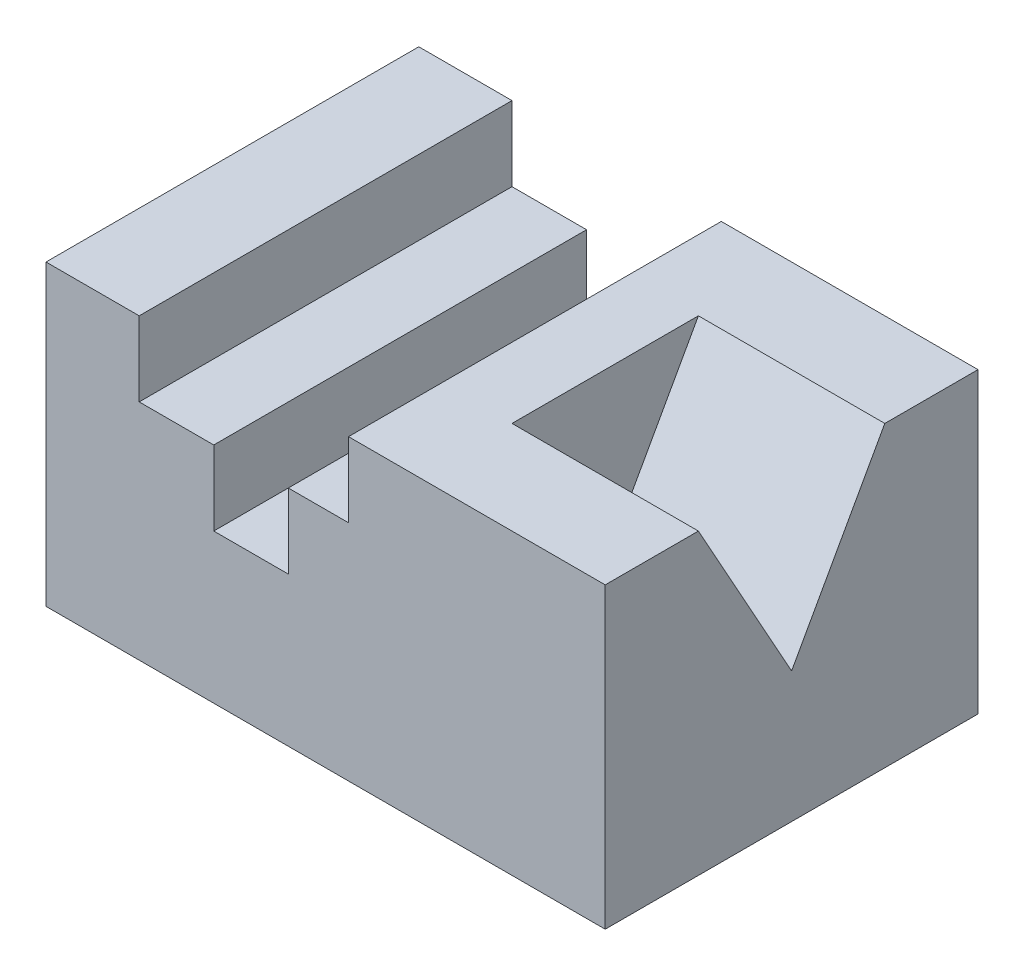
ISO-10303-21;
HEADER;
FILE_DESCRIPTION(('STEP AP214'),'2;1');
FILE_NAME('part.step','',(''),(''),'','','');
FILE_SCHEMA(('AUTOMOTIVE_DESIGN { 1 0 10303 214 1 1 1 1 }'));
ENDSEC;
DATA;
#1=APPLICATION_CONTEXT('core data for automotive mechanical design processes');
#2=APPLICATION_PROTOCOL_DEFINITION('international standard','automotive_design',2000,#1);
#3=PRODUCT_CONTEXT('',#1,'mechanical');
#4=PRODUCT('Part','Part','',(#3));
#5=PRODUCT_RELATED_PRODUCT_CATEGORY('part','',(#4));
#6=PRODUCT_DEFINITION_FORMATION('','',#4);
#7=PRODUCT_DEFINITION_CONTEXT('part definition',#1,'design');
#8=PRODUCT_DEFINITION('design','',#6,#7);
#9=PRODUCT_DEFINITION_SHAPE('','',#8);
#10=(LENGTH_UNIT() NAMED_UNIT(*) SI_UNIT(.MILLI.,.METRE.));
#11=(NAMED_UNIT(*) PLANE_ANGLE_UNIT() SI_UNIT($,.RADIAN.));
#12=(NAMED_UNIT(*) SI_UNIT($,.STERADIAN.) SOLID_ANGLE_UNIT());
#13=UNCERTAINTY_MEASURE_WITH_UNIT(LENGTH_MEASURE(1.E-05),#10,'distance_accuracy_value','');
#14=(GEOMETRIC_REPRESENTATION_CONTEXT(3) GLOBAL_UNCERTAINTY_ASSIGNED_CONTEXT((#13)) GLOBAL_UNIT_ASSIGNED_CONTEXT((#10,
#11,#12)) REPRESENTATION_CONTEXT('',''));
#15=CARTESIAN_POINT('',(0.,0.,0.));
#16=DIRECTION('',(0.,0.,1.));
#17=DIRECTION('',(1.,0.,0.));
#18=AXIS2_PLACEMENT_3D('',#15,#16,#17);
#19=CARTESIAN_POINT('',(-59.8228170907612,44.4267392149242,-100.));
#20=DIRECTION('',(0.,1.,0.));
#21=DIRECTION('',(-1.,0.,0.));
#22=AXIS2_PLACEMENT_3D('',#19,#20,#21);
#23=PLANE('',#22);
#24=DIRECTION('',(-1.,0.,0.));
#25=VECTOR('',#24,1.);
#26=CARTESIAN_POINT('',(-59.8228170907612,44.4267392149242,0.));
#27=LINE('',#26,#25);
#28=CARTESIAN_POINT('',(-34.8228170907612,44.4267392149242,0.));
#29=VERTEX_POINT('',#28);
#30=CARTESIAN_POINT('',(-59.8228170907612,44.4267392149242,0.));
#31=VERTEX_POINT('',#30);
#32=EDGE_CURVE('E252',#29,#31,#27,.T.);
#33=ORIENTED_EDGE('',*,*,#32,.F.);
#34=DIRECTION('',(0.,0.,-1.));
#35=VECTOR('',#34,1.);
#36=CARTESIAN_POINT('',(-34.8228170907612,44.4267392149242,246.53853654145));
#37=LINE('',#36,#35);
#38=CARTESIAN_POINT('',(-34.8228170907612,44.4267392149242,-100.));
#39=VERTEX_POINT('',#38);
#40=EDGE_CURVE('E208',#29,#39,#37,.T.);
#41=ORIENTED_EDGE('',*,*,#40,.T.);
#42=DIRECTION('',(-1.,0.,0.));
#43=VECTOR('',#42,1.);
#44=CARTESIAN_POINT('',(-59.8228170907612,44.4267392149242,-100.));
#45=LINE('',#44,#43);
#46=CARTESIAN_POINT('',(-59.8228170907612,44.4267392149242,-100.));
#47=VERTEX_POINT('',#46);
#48=EDGE_CURVE('E238',#39,#47,#45,.T.);
#49=ORIENTED_EDGE('',*,*,#48,.T.);
#50=DIRECTION('',(0.,0.,1.));
#51=VECTOR('',#50,1.);
#52=CARTESIAN_POINT('',(-59.8228170907612,44.4267392149242,-100.));
#53=LINE('',#52,#51);
#54=EDGE_CURVE('E11',#47,#31,#53,.T.);
#55=ORIENTED_EDGE('',*,*,#54,.T.);
#56=EDGE_LOOP('',(#33,#41,#49,#55));
#57=FACE_BOUND('',#56,.T.);
#58=ADVANCED_FACE('F39',(#57),#23,.T.);
#59=CARTESIAN_POINT('',(-59.8228170907612,44.4267392149242,-100.));
#60=DIRECTION('',(-1.,0.,0.));
#61=DIRECTION('',(0.,0.,1.));
#62=AXIS2_PLACEMENT_3D('',#59,#60,#61);
#63=PLANE('',#62);
#64=DIRECTION('',(0.,-1.,0.));
#65=VECTOR('',#64,1.);
#66=CARTESIAN_POINT('',(-59.8228170907612,44.4267392149242,0.));
#67=LINE('',#66,#65);
#68=CARTESIAN_POINT('',(-59.8228170907612,-35.5732607850758,0.));
#69=VERTEX_POINT('',#68);
#70=EDGE_CURVE('E187',#31,#69,#67,.T.);
#71=ORIENTED_EDGE('',*,*,#70,.F.);
#72=ORIENTED_EDGE('',*,*,#54,.F.);
#73=DIRECTION('',(0.,-1.,0.));
#74=VECTOR('',#73,1.);
#75=CARTESIAN_POINT('',(-59.8228170907612,44.4267392149242,-100.));
#76=LINE('',#75,#74);
#77=CARTESIAN_POINT('',(-59.8228170907612,-35.5732607850758,-100.));
#78=VERTEX_POINT('',#77);
#79=EDGE_CURVE('E228',#47,#78,#76,.T.);
#80=ORIENTED_EDGE('',*,*,#79,.T.);
#81=DIRECTION('',(0.,0.,1.));
#82=VECTOR('',#81,1.);
#83=CARTESIAN_POINT('',(-59.8228170907612,-35.5732607850758,-100.));
#84=LINE('',#83,#82);
#85=EDGE_CURVE('E43',#78,#69,#84,.T.);
#86=ORIENTED_EDGE('',*,*,#85,.T.);
#87=EDGE_LOOP('',(#71,#72,#80,#86));
#88=FACE_BOUND('',#87,.T.);
#89=ADVANCED_FACE('F41',(#88),#63,.T.);
#90=DIRECTION('',(-1.,0.,0.));
#91=VECTOR('',#90,1.);
#92=CARTESIAN_POINT('',(492.965719450689,44.4267392149243,-75.));
#93=LINE('',#92,#91);
#94=CARTESIAN_POINT('',(90.1771829092388,44.4267392149243,-75.));
#95=VERTEX_POINT('',#94);
#96=CARTESIAN_POINT('',(40.1771829092388,44.4267392149243,-75.));
#97=VERTEX_POINT('',#96);
#98=EDGE_CURVE('E57',#95,#97,#93,.T.);
#99=ORIENTED_EDGE('',*,*,#98,.F.);
#100=DIRECTION('',(0.,0.,1.));
#101=VECTOR('',#100,1.);
#102=CARTESIAN_POINT('',(90.1771829092388,44.4267392149243,-100.));
#103=LINE('',#102,#101);
#104=CARTESIAN_POINT('',(90.1771829092388,44.4267392149243,-100.));
#105=VERTEX_POINT('',#104);
#106=EDGE_CURVE('E48',#105,#95,#103,.T.);
#107=ORIENTED_EDGE('',*,*,#106,.F.);
#108=CARTESIAN_POINT('',(21.3197011929034,44.4267392149243,-100.));
#109=VERTEX_POINT('',#108);
#110=EDGE_CURVE('E242',#105,#109,#45,.T.);
#111=ORIENTED_EDGE('',*,*,#110,.T.);
#112=DIRECTION('',(0.,0.,-1.));
#113=VECTOR('',#112,1.);
#114=CARTESIAN_POINT('',(21.3197011929034,44.4267392149243,246.53853654145));
#115=LINE('',#114,#113);
#116=CARTESIAN_POINT('',(21.3197011929034,44.4267392149243,0.));
#117=VERTEX_POINT('',#116);
#118=EDGE_CURVE('E221',#117,#109,#115,.T.);
#119=ORIENTED_EDGE('',*,*,#118,.F.);
#120=CARTESIAN_POINT('',(90.1771829092388,44.4267392149243,0.));
#121=VERTEX_POINT('',#120);
#122=EDGE_CURVE('E232',#121,#117,#27,.T.);
#123=ORIENTED_EDGE('',*,*,#122,.F.);
#124=CARTESIAN_POINT('',(90.1771829092388,44.4267392149243,-25.));
#125=VERTEX_POINT('',#124);
#126=EDGE_CURVE('E258',#125,#121,#103,.T.);
#127=ORIENTED_EDGE('',*,*,#126,.F.);
#128=DIRECTION('',(-1.,0.,0.));
#129=VECTOR('',#128,1.);
#130=CARTESIAN_POINT('',(492.965719450689,44.4267392149243,-25.));
#131=LINE('',#130,#129);
#132=CARTESIAN_POINT('',(40.1771829092388,44.4267392149243,-25.));
#133=VERTEX_POINT('',#132);
#134=EDGE_CURVE('E161',#125,#133,#131,.T.);
#135=ORIENTED_EDGE('',*,*,#134,.T.);
#136=DIRECTION('',(0.,0.,1.));
#137=VECTOR('',#136,1.);
#138=CARTESIAN_POINT('',(40.1771829092388,44.4267392149243,-100.));
#139=LINE('',#138,#137);
#140=EDGE_CURVE('E155',#97,#133,#139,.T.);
#141=ORIENTED_EDGE('',*,*,#140,.F.);
#142=EDGE_LOOP('',(#99,#107,#111,#119,#123,#127,#135,#141));
#143=FACE_BOUND('',#142,.T.);
#144=ADVANCED_FACE('F283',(#143),#23,.T.);
#145=CARTESIAN_POINT('',(90.1771829092388,44.4267392149243,-100.));
#146=DIRECTION('',(1.,0.,0.));
#147=DIRECTION('',(0.,0.,-1.));
#148=AXIS2_PLACEMENT_3D('',#145,#146,#147);
#149=PLANE('',#148);
#150=DIRECTION('',(0.,0.874157276121538,-0.485642931178632));
#151=VECTOR('',#150,1.);
#152=CARTESIAN_POINT('',(90.1771829092388,-0.573260785075747,-50.));
#153=LINE('',#152,#151);
#154=CARTESIAN_POINT('',(90.1771829092388,-0.573260785075747,-50.));
#155=VERTEX_POINT('',#154);
#156=EDGE_CURVE('E167',#155,#95,#153,.T.);
#157=ORIENTED_EDGE('',*,*,#156,.F.);
#158=DIRECTION('',(0.,-0.874157276121538,-0.485642931178632));
#159=VECTOR('',#158,1.);
#160=CARTESIAN_POINT('',(90.1771829092388,44.4267392149243,-25.));
#161=LINE('',#160,#159);
#162=EDGE_CURVE('E164',#125,#155,#161,.T.);
#163=ORIENTED_EDGE('',*,*,#162,.F.);
#164=ORIENTED_EDGE('',*,*,#126,.T.);
#165=DIRECTION('',(0.,1.,0.));
#166=VECTOR('',#165,1.);
#167=CARTESIAN_POINT('',(90.1771829092388,44.4267392149243,0.));
#168=LINE('',#167,#166);
#169=CARTESIAN_POINT('',(90.1771829092388,-35.5732607850758,0.));
#170=VERTEX_POINT('',#169);
#171=EDGE_CURVE('E247',#170,#121,#168,.T.);
#172=ORIENTED_EDGE('',*,*,#171,.F.);
#173=DIRECTION('',(0.,0.,1.));
#174=VECTOR('',#173,1.);
#175=CARTESIAN_POINT('',(90.1771829092388,-35.5732607850758,-100.));
#176=LINE('',#175,#174);
#177=CARTESIAN_POINT('',(90.1771829092388,-35.5732607850758,-100.));
#178=VERTEX_POINT('',#177);
#179=EDGE_CURVE('E260',#178,#170,#176,.T.);
#180=ORIENTED_EDGE('',*,*,#179,.F.);
#181=DIRECTION('',(0.,1.,0.));
#182=VECTOR('',#181,1.);
#183=CARTESIAN_POINT('',(90.1771829092388,44.4267392149243,-100.));
#184=LINE('',#183,#182);
#185=EDGE_CURVE('E240',#178,#105,#184,.T.);
#186=ORIENTED_EDGE('',*,*,#185,.T.);
#187=ORIENTED_EDGE('',*,*,#106,.T.);
#188=EDGE_LOOP('',(#157,#163,#164,#172,#180,#186,#187));
#189=FACE_BOUND('',#188,.T.);
#190=ADVANCED_FACE('F278',(#189),#149,.T.);
#191=CARTESIAN_POINT('',(-59.8228170907612,-35.5732607850758,-100.));
#192=DIRECTION('',(0.,-1.,0.));
#193=DIRECTION('',(0.,0.,-1.));
#194=AXIS2_PLACEMENT_3D('',#191,#192,#193);
#195=PLANE('',#194);
#196=DIRECTION('',(1.,0.,0.));
#197=VECTOR('',#196,1.);
#198=CARTESIAN_POINT('',(-59.8228170907612,-35.5732607850758,0.));
#199=LINE('',#198,#197);
#200=EDGE_CURVE('E248',#69,#170,#199,.T.);
#201=ORIENTED_EDGE('',*,*,#200,.F.);
#202=ORIENTED_EDGE('',*,*,#85,.F.);
#203=DIRECTION('',(1.,0.,0.));
#204=VECTOR('',#203,1.);
#205=CARTESIAN_POINT('',(-59.8228170907612,-35.5732607850758,-100.));
#206=LINE('',#205,#204);
#207=EDGE_CURVE('E231',#78,#178,#206,.T.);
#208=ORIENTED_EDGE('',*,*,#207,.T.);
#209=ORIENTED_EDGE('',*,*,#179,.T.);
#210=EDGE_LOOP('',(#201,#202,#208,#209));
#211=FACE_BOUND('',#210,.T.);
#212=ADVANCED_FACE('F266',(#211),#195,.T.);
#213=CARTESIAN_POINT('',(0.,0.,-100.));
#214=DIRECTION('',(0.,0.,1.));
#215=DIRECTION('',(1.,0.,0.));
#216=AXIS2_PLACEMENT_3D('',#213,#214,#215);
#217=PLANE('',#216);
#218=ORIENTED_EDGE('',*,*,#48,.F.);
#219=DIRECTION('',(0.,-1.,0.));
#220=VECTOR('',#219,1.);
#221=CARTESIAN_POINT('',(-34.8228170907612,44.4267392149242,-100.));
#222=LINE('',#221,#220);
#223=CARTESIAN_POINT('',(-34.8228170907612,24.4267392149242,-100.));
#224=VERTEX_POINT('',#223);
#225=EDGE_CURVE('E190',#39,#224,#222,.T.);
#226=ORIENTED_EDGE('',*,*,#225,.T.);
#227=DIRECTION('',(1.,0.,0.));
#228=VECTOR('',#227,1.);
#229=CARTESIAN_POINT('',(-34.8228170907612,24.4267392149242,-100.));
#230=LINE('',#229,#228);
#231=CARTESIAN_POINT('',(-14.8228170907612,24.4267392149242,-100.));
#232=VERTEX_POINT('',#231);
#233=EDGE_CURVE('E188',#224,#232,#230,.T.);
#234=ORIENTED_EDGE('',*,*,#233,.T.);
#235=DIRECTION('',(0.,-1.,0.));
#236=VECTOR('',#235,1.);
#237=CARTESIAN_POINT('',(-14.8228170907612,24.4267392149242,-100.));
#238=LINE('',#237,#236);
#239=CARTESIAN_POINT('',(-14.8228170907612,4.42673921492426,-100.));
#240=VERTEX_POINT('',#239);
#241=EDGE_CURVE('E191',#232,#240,#238,.T.);
#242=ORIENTED_EDGE('',*,*,#241,.T.);
#243=DIRECTION('',(1.,0.,0.));
#244=VECTOR('',#243,1.);
#245=CARTESIAN_POINT('',(-14.8228170907612,4.42673921492426,-100.));
#246=LINE('',#245,#244);
#247=CARTESIAN_POINT('',(5.17718290923879,4.42673921492426,-100.));
#248=VERTEX_POINT('',#247);
#249=EDGE_CURVE('E198',#240,#248,#246,.T.);
#250=ORIENTED_EDGE('',*,*,#249,.T.);
#251=DIRECTION('',(0.,1.,0.));
#252=VECTOR('',#251,1.);
#253=CARTESIAN_POINT('',(5.17718290923879,4.42673921492426,-100.));
#254=LINE('',#253,#252);
#255=CARTESIAN_POINT('',(5.17718290923879,24.4267392149243,-100.));
#256=VERTEX_POINT('',#255);
#257=EDGE_CURVE('E200',#248,#256,#254,.T.);
#258=ORIENTED_EDGE('',*,*,#257,.T.);
#259=DIRECTION('',(1.,0.,0.));
#260=VECTOR('',#259,1.);
#261=CARTESIAN_POINT('',(5.17718290923879,24.4267392149243,-100.));
#262=LINE('',#261,#260);
#263=CARTESIAN_POINT('',(21.3197011929034,24.4267392149243,-100.));
#264=VERTEX_POINT('',#263);
#265=EDGE_CURVE('E205',#256,#264,#262,.T.);
#266=ORIENTED_EDGE('',*,*,#265,.T.);
#267=DIRECTION('',(0.,1.,0.));
#268=VECTOR('',#267,1.);
#269=CARTESIAN_POINT('',(21.3197011929034,24.4267392149243,-100.));
#270=LINE('',#269,#268);
#271=EDGE_CURVE('E202',#264,#109,#270,.T.);
#272=ORIENTED_EDGE('',*,*,#271,.T.);
#273=ORIENTED_EDGE('',*,*,#110,.F.);
#274=ORIENTED_EDGE('',*,*,#185,.F.);
#275=ORIENTED_EDGE('',*,*,#207,.F.);
#276=ORIENTED_EDGE('',*,*,#79,.F.);
#277=EDGE_LOOP('',(#218,#226,#234,#242,#250,#258,#266,#272,#273,#274,#275,#276));
#278=FACE_BOUND('',#277,.T.);
#279=ADVANCED_FACE('F277',(#278),#217,.F.);
#280=CARTESIAN_POINT('',(0.,0.,0.));
#281=DIRECTION('',(0.,0.,1.));
#282=DIRECTION('',(1.,0.,0.));
#283=AXIS2_PLACEMENT_3D('',#280,#281,#282);
#284=PLANE('',#283);
#285=DIRECTION('',(0.,1.,0.));
#286=VECTOR('',#285,1.);
#287=CARTESIAN_POINT('',(21.3197011929034,24.4267392149243,0.));
#288=LINE('',#287,#286);
#289=CARTESIAN_POINT('',(21.3197011929034,24.4267392149243,0.));
#290=VERTEX_POINT('',#289);
#291=EDGE_CURVE('E178',#290,#117,#288,.T.);
#292=ORIENTED_EDGE('',*,*,#291,.F.);
#293=DIRECTION('',(1.,0.,0.));
#294=VECTOR('',#293,1.);
#295=CARTESIAN_POINT('',(5.17718290923879,24.4267392149243,0.));
#296=LINE('',#295,#294);
#297=CARTESIAN_POINT('',(5.17718290923879,24.4267392149243,0.));
#298=VERTEX_POINT('',#297);
#299=EDGE_CURVE('E174',#298,#290,#296,.T.);
#300=ORIENTED_EDGE('',*,*,#299,.F.);
#301=DIRECTION('',(0.,1.,0.));
#302=VECTOR('',#301,1.);
#303=CARTESIAN_POINT('',(5.17718290923879,4.42673921492426,0.));
#304=LINE('',#303,#302);
#305=CARTESIAN_POINT('',(5.17718290923879,4.42673921492426,0.));
#306=VERTEX_POINT('',#305);
#307=EDGE_CURVE('E173',#306,#298,#304,.T.);
#308=ORIENTED_EDGE('',*,*,#307,.F.);
#309=DIRECTION('',(1.,0.,0.));
#310=VECTOR('',#309,1.);
#311=CARTESIAN_POINT('',(-14.8228170907612,4.42673921492426,0.));
#312=LINE('',#311,#310);
#313=CARTESIAN_POINT('',(-14.8228170907612,4.42673921492426,0.));
#314=VERTEX_POINT('',#313);
#315=EDGE_CURVE('E176',#314,#306,#312,.T.);
#316=ORIENTED_EDGE('',*,*,#315,.F.);
#317=DIRECTION('',(0.,-1.,0.));
#318=VECTOR('',#317,1.);
#319=CARTESIAN_POINT('',(-14.8228170907612,24.4267392149242,0.));
#320=LINE('',#319,#318);
#321=CARTESIAN_POINT('',(-14.8228170907612,24.4267392149242,0.));
#322=VERTEX_POINT('',#321);
#323=EDGE_CURVE('E179',#322,#314,#320,.T.);
#324=ORIENTED_EDGE('',*,*,#323,.F.);
#325=DIRECTION('',(1.,0.,0.));
#326=VECTOR('',#325,1.);
#327=CARTESIAN_POINT('',(-34.8228170907612,24.4267392149242,0.));
#328=LINE('',#327,#326);
#329=CARTESIAN_POINT('',(-34.8228170907612,24.4267392149242,0.));
#330=VERTEX_POINT('',#329);
#331=EDGE_CURVE('E185',#330,#322,#328,.T.);
#332=ORIENTED_EDGE('',*,*,#331,.F.);
#333=DIRECTION('',(0.,-1.,0.));
#334=VECTOR('',#333,1.);
#335=CARTESIAN_POINT('',(-34.8228170907612,44.4267392149242,0.));
#336=LINE('',#335,#334);
#337=EDGE_CURVE('E184',#29,#330,#336,.T.);
#338=ORIENTED_EDGE('',*,*,#337,.F.);
#339=ORIENTED_EDGE('',*,*,#32,.T.);
#340=ORIENTED_EDGE('',*,*,#70,.T.);
#341=ORIENTED_EDGE('',*,*,#200,.T.);
#342=ORIENTED_EDGE('',*,*,#171,.T.);
#343=ORIENTED_EDGE('',*,*,#122,.T.);
#344=EDGE_LOOP('',(#292,#300,#308,#316,#324,#332,#338,#339,#340,#341,#342,#343));
#345=FACE_BOUND('',#344,.T.);
#346=ADVANCED_FACE('F267',(#345),#284,.T.);
#347=CARTESIAN_POINT('',(21.3197011929034,24.4267392149243,246.53853654145));
#348=DIRECTION('',(-1.,0.,0.));
#349=DIRECTION('',(0.,-1.,0.));
#350=AXIS2_PLACEMENT_3D('',#347,#348,#349);
#351=PLANE('',#350);
#352=DIRECTION('',(0.,0.,-1.));
#353=VECTOR('',#352,1.);
#354=CARTESIAN_POINT('',(21.3197011929034,24.4267392149243,246.53853654145));
#355=LINE('',#354,#353);
#356=EDGE_CURVE('E227',#290,#264,#355,.T.);
#357=ORIENTED_EDGE('',*,*,#356,.F.);
#358=ORIENTED_EDGE('',*,*,#291,.T.);
#359=ORIENTED_EDGE('',*,*,#118,.T.);
#360=ORIENTED_EDGE('',*,*,#271,.F.);
#361=EDGE_LOOP('',(#357,#358,#359,#360));
#362=FACE_BOUND('',#361,.T.);
#363=ADVANCED_FACE('F286',(#362),#351,.T.);
#364=CARTESIAN_POINT('',(5.17718290923879,24.4267392149243,246.53853654145));
#365=DIRECTION('',(0.,1.,0.));
#366=DIRECTION('',(0.,0.,1.));
#367=AXIS2_PLACEMENT_3D('',#364,#365,#366);
#368=PLANE('',#367);
#369=DIRECTION('',(0.,0.,-1.));
#370=VECTOR('',#369,1.);
#371=CARTESIAN_POINT('',(5.17718290923879,24.4267392149243,246.53853654145));
#372=LINE('',#371,#370);
#373=EDGE_CURVE('E222',#298,#256,#372,.T.);
#374=ORIENTED_EDGE('',*,*,#373,.F.);
#375=ORIENTED_EDGE('',*,*,#299,.T.);
#376=ORIENTED_EDGE('',*,*,#356,.T.);
#377=ORIENTED_EDGE('',*,*,#265,.F.);
#378=EDGE_LOOP('',(#374,#375,#376,#377));
#379=FACE_BOUND('',#378,.T.);
#380=ADVANCED_FACE('F292',(#379),#368,.T.);
#381=CARTESIAN_POINT('',(5.17718290923879,4.42673921492426,246.53853654145));
#382=DIRECTION('',(-1.,0.,0.));
#383=DIRECTION('',(0.,0.,1.));
#384=AXIS2_PLACEMENT_3D('',#381,#382,#383);
#385=PLANE('',#384);
#386=DIRECTION('',(0.,0.,-1.));
#387=VECTOR('',#386,1.);
#388=CARTESIAN_POINT('',(5.17718290923879,4.42673921492426,246.53853654145));
#389=LINE('',#388,#387);
#390=EDGE_CURVE('E217',#306,#248,#389,.T.);
#391=ORIENTED_EDGE('',*,*,#390,.F.);
#392=ORIENTED_EDGE('',*,*,#307,.T.);
#393=ORIENTED_EDGE('',*,*,#373,.T.);
#394=ORIENTED_EDGE('',*,*,#257,.F.);
#395=EDGE_LOOP('',(#391,#392,#393,#394));
#396=FACE_BOUND('',#395,.T.);
#397=ADVANCED_FACE('F293',(#396),#385,.T.);
#398=CARTESIAN_POINT('',(-14.8228170907612,4.42673921492426,246.53853654145));
#399=DIRECTION('',(0.,1.,0.));
#400=DIRECTION('',(0.,0.,1.));
#401=AXIS2_PLACEMENT_3D('',#398,#399,#400);
#402=PLANE('',#401);
#403=DIRECTION('',(0.,0.,-1.));
#404=VECTOR('',#403,1.);
#405=CARTESIAN_POINT('',(-14.8228170907612,4.42673921492426,246.53853654145));
#406=LINE('',#405,#404);
#407=EDGE_CURVE('E214',#314,#240,#406,.T.);
#408=ORIENTED_EDGE('',*,*,#407,.F.);
#409=ORIENTED_EDGE('',*,*,#315,.T.);
#410=ORIENTED_EDGE('',*,*,#390,.T.);
#411=ORIENTED_EDGE('',*,*,#249,.F.);
#412=EDGE_LOOP('',(#408,#409,#410,#411));
#413=FACE_BOUND('',#412,.T.);
#414=ADVANCED_FACE('F303',(#413),#402,.T.);
#415=CARTESIAN_POINT('',(-14.8228170907612,24.4267392149242,246.53853654145));
#416=DIRECTION('',(1.,0.,0.));
#417=DIRECTION('',(0.,1.,0.));
#418=AXIS2_PLACEMENT_3D('',#415,#416,#417);
#419=PLANE('',#418);
#420=DIRECTION('',(0.,0.,-1.));
#421=VECTOR('',#420,1.);
#422=CARTESIAN_POINT('',(-14.8228170907612,24.4267392149242,246.53853654145));
#423=LINE('',#422,#421);
#424=EDGE_CURVE('E215',#322,#232,#423,.T.);
#425=ORIENTED_EDGE('',*,*,#424,.F.);
#426=ORIENTED_EDGE('',*,*,#323,.T.);
#427=ORIENTED_EDGE('',*,*,#407,.T.);
#428=ORIENTED_EDGE('',*,*,#241,.F.);
#429=EDGE_LOOP('',(#425,#426,#427,#428));
#430=FACE_BOUND('',#429,.T.);
#431=ADVANCED_FACE('F302',(#430),#419,.T.);
#432=CARTESIAN_POINT('',(-34.8228170907612,24.4267392149242,246.53853654145));
#433=DIRECTION('',(0.,1.,0.));
#434=DIRECTION('',(0.,0.,1.));
#435=AXIS2_PLACEMENT_3D('',#432,#433,#434);
#436=PLANE('',#435);
#437=DIRECTION('',(0.,0.,-1.));
#438=VECTOR('',#437,1.);
#439=CARTESIAN_POINT('',(-34.8228170907612,24.4267392149242,246.53853654145));
#440=LINE('',#439,#438);
#441=EDGE_CURVE('E61',#330,#224,#440,.T.);
#442=ORIENTED_EDGE('',*,*,#441,.F.);
#443=ORIENTED_EDGE('',*,*,#331,.T.);
#444=ORIENTED_EDGE('',*,*,#424,.T.);
#445=ORIENTED_EDGE('',*,*,#233,.F.);
#446=EDGE_LOOP('',(#442,#443,#444,#445));
#447=FACE_BOUND('',#446,.T.);
#448=ADVANCED_FACE('F304',(#447),#436,.T.);
#449=CARTESIAN_POINT('',(-34.8228170907612,44.4267392149242,246.53853654145));
#450=DIRECTION('',(1.,0.,0.));
#451=DIRECTION('',(0.,0.,-1.));
#452=AXIS2_PLACEMENT_3D('',#449,#450,#451);
#453=PLANE('',#452);
#454=ORIENTED_EDGE('',*,*,#40,.F.);
#455=ORIENTED_EDGE('',*,*,#337,.T.);
#456=ORIENTED_EDGE('',*,*,#441,.T.);
#457=ORIENTED_EDGE('',*,*,#225,.F.);
#458=EDGE_LOOP('',(#454,#455,#456,#457));
#459=FACE_BOUND('',#458,.T.);
#460=ADVANCED_FACE('F307',(#459),#453,.T.);
#461=CARTESIAN_POINT('',(492.965719450689,-0.573260785075747,-50.));
#462=DIRECTION('',(0.,0.485642931178632,0.874157276121538));
#463=DIRECTION('',(0.,-0.874157276121538,0.485642931178632));
#464=AXIS2_PLACEMENT_3D('',#461,#462,#463);
#465=PLANE('',#464);
#466=DIRECTION('',(-1.,0.,0.));
#467=VECTOR('',#466,1.);
#468=CARTESIAN_POINT('',(492.965719450689,-0.573260785075747,-50.));
#469=LINE('',#468,#467);
#470=CARTESIAN_POINT('',(40.1771829092388,-0.573260785075747,-50.));
#471=VERTEX_POINT('',#470);
#472=EDGE_CURVE('E157',#155,#471,#469,.T.);
#473=ORIENTED_EDGE('',*,*,#472,.F.);
#474=ORIENTED_EDGE('',*,*,#156,.T.);
#475=ORIENTED_EDGE('',*,*,#98,.T.);
#476=DIRECTION('',(0.,0.874157276121538,-0.485642931178632));
#477=VECTOR('',#476,1.);
#478=CARTESIAN_POINT('',(40.1771829092388,-0.573260785075747,-50.));
#479=LINE('',#478,#477);
#480=EDGE_CURVE('E147',#471,#97,#479,.T.);
#481=ORIENTED_EDGE('',*,*,#480,.F.);
#482=EDGE_LOOP('',(#473,#474,#475,#481));
#483=FACE_BOUND('',#482,.T.);
#484=ADVANCED_FACE('F158',(#483),#465,.T.);
#485=CARTESIAN_POINT('',(492.965719450689,44.4267392149243,-25.));
#486=DIRECTION('',(0.,0.485642931178632,-0.874157276121538));
#487=DIRECTION('',(0.,0.874157276121538,0.485642931178632));
#488=AXIS2_PLACEMENT_3D('',#485,#486,#487);
#489=PLANE('',#488);
#490=ORIENTED_EDGE('',*,*,#134,.F.);
#491=ORIENTED_EDGE('',*,*,#162,.T.);
#492=ORIENTED_EDGE('',*,*,#472,.T.);
#493=DIRECTION('',(0.,-0.874157276121538,-0.485642931178632));
#494=VECTOR('',#493,1.);
#495=CARTESIAN_POINT('',(40.1771829092388,44.4267392149243,-25.));
#496=LINE('',#495,#494);
#497=EDGE_CURVE('E146',#133,#471,#496,.T.);
#498=ORIENTED_EDGE('',*,*,#497,.F.);
#499=EDGE_LOOP('',(#490,#491,#492,#498));
#500=FACE_BOUND('',#499,.T.);
#501=ADVANCED_FACE('F162',(#500),#489,.T.);
#502=CARTESIAN_POINT('',(40.1771829092388,44.4267392149243,-100.));
#503=DIRECTION('',(1.,0.,0.));
#504=DIRECTION('',(0.,0.,-1.));
#505=AXIS2_PLACEMENT_3D('',#502,#503,#504);
#506=PLANE('',#505);
#507=ORIENTED_EDGE('',*,*,#497,.T.);
#508=ORIENTED_EDGE('',*,*,#480,.T.);
#509=ORIENTED_EDGE('',*,*,#140,.T.);
#510=EDGE_LOOP('',(#507,#508,#509));
#511=FACE_BOUND('',#510,.T.);
#512=ADVANCED_FACE('F149',(#511),#506,.T.);
#513=CLOSED_SHELL('',(#58,#89,#144,#190,#212,#279,#346,#363,#380,#397,#414,#431,#448,#460,#484,
#501,#512));
#514=MANIFOLD_SOLID_BREP('B2',#513);
#515=ADVANCED_BREP_SHAPE_REPRESENTATION('',(#18,#514),#14);
#516=SHAPE_DEFINITION_REPRESENTATION(#9,#515);
ENDSEC;
END-ISO-10303-21;
